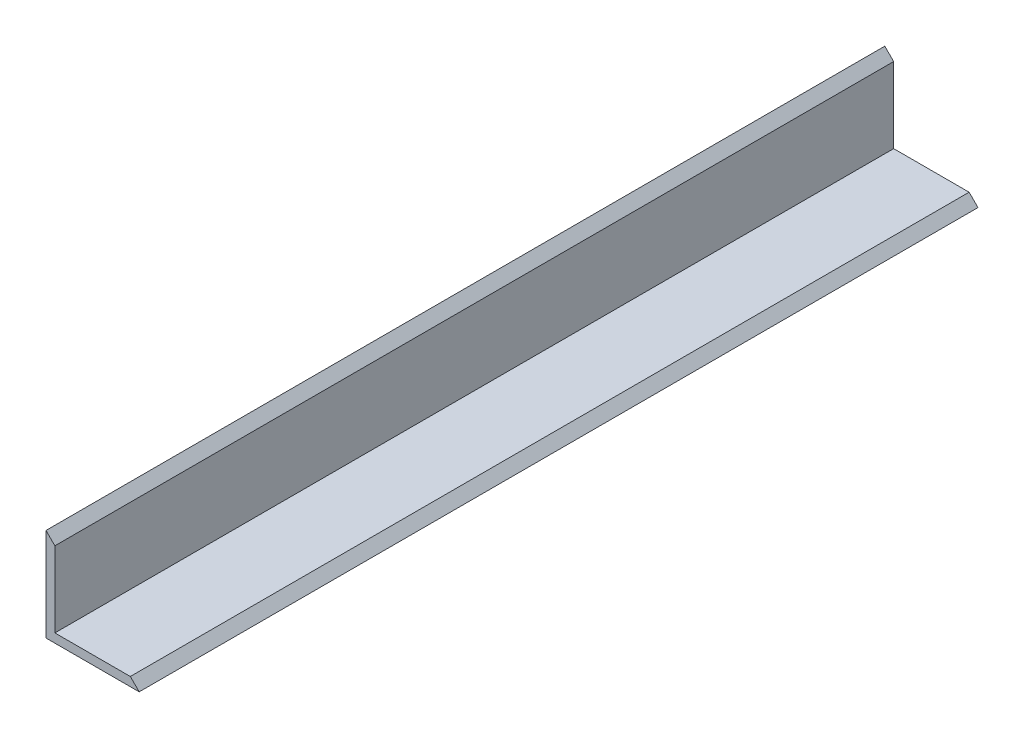
ISO-10303-21;
HEADER;
FILE_DESCRIPTION(('STEP AP214'),'2;1');
FILE_NAME('part.step','',(''),(''),'','','');
FILE_SCHEMA(('AUTOMOTIVE_DESIGN { 1 0 10303 214 1 1 1 1 }'));
ENDSEC;
DATA;
#1=APPLICATION_CONTEXT('core data for automotive mechanical design processes');
#2=APPLICATION_PROTOCOL_DEFINITION('international standard','automotive_design',2000,#1);
#3=PRODUCT_CONTEXT('',#1,'mechanical');
#4=PRODUCT('Part','Part','',(#3));
#5=PRODUCT_RELATED_PRODUCT_CATEGORY('part','',(#4));
#6=PRODUCT_DEFINITION_FORMATION('','',#4);
#7=PRODUCT_DEFINITION_CONTEXT('part definition',#1,'design');
#8=PRODUCT_DEFINITION('design','',#6,#7);
#9=PRODUCT_DEFINITION_SHAPE('','',#8);
#10=(LENGTH_UNIT() NAMED_UNIT(*) SI_UNIT(.MILLI.,.METRE.));
#11=(NAMED_UNIT(*) PLANE_ANGLE_UNIT() SI_UNIT($,.RADIAN.));
#12=(NAMED_UNIT(*) SI_UNIT($,.STERADIAN.) SOLID_ANGLE_UNIT());
#13=UNCERTAINTY_MEASURE_WITH_UNIT(LENGTH_MEASURE(1.E-05),#10,'distance_accuracy_value','');
#14=(GEOMETRIC_REPRESENTATION_CONTEXT(3) GLOBAL_UNCERTAINTY_ASSIGNED_CONTEXT((#13)) GLOBAL_UNIT_ASSIGNED_CONTEXT((#10,
#11,#12)) REPRESENTATION_CONTEXT('',''));
#15=CARTESIAN_POINT('',(0.,0.,0.));
#16=DIRECTION('',(0.,0.,1.));
#17=DIRECTION('',(1.,0.,0.));
#18=AXIS2_PLACEMENT_3D('',#15,#16,#17);
#19=CARTESIAN_POINT('',(-5.,100.,945.));
#20=DIRECTION('',(1.,0.,0.));
#21=DIRECTION('',(0.,0.,-1.));
#22=AXIS2_PLACEMENT_3D('',#19,#20,#21);
#23=PLANE('',#22);
#24=DIRECTION('',(0.,-1.,0.));
#25=VECTOR('',#24,1.);
#26=CARTESIAN_POINT('',(-5.,100.,0.));
#27=LINE('',#26,#25);
#28=CARTESIAN_POINT('',(-5.,100.,0.));
#29=VERTEX_POINT('',#28);
#30=CARTESIAN_POINT('',(-5.,-5.,0.));
#31=VERTEX_POINT('',#30);
#32=EDGE_CURVE('E117',#29,#31,#27,.T.);
#33=ORIENTED_EDGE('',*,*,#32,.T.);
#34=DIRECTION('',(0.,0.,-1.));
#35=VECTOR('',#34,1.);
#36=CARTESIAN_POINT('',(-5.,-5.,945.));
#37=LINE('',#36,#35);
#38=CARTESIAN_POINT('',(-5.,-5.,945.));
#39=VERTEX_POINT('',#38);
#40=EDGE_CURVE('E109',#39,#31,#37,.T.);
#41=ORIENTED_EDGE('',*,*,#40,.F.);
#42=DIRECTION('',(0.,-1.,0.));
#43=VECTOR('',#42,1.);
#44=CARTESIAN_POINT('',(-5.,100.,945.));
#45=LINE('',#44,#43);
#46=CARTESIAN_POINT('',(-5.,100.,945.));
#47=VERTEX_POINT('',#46);
#48=EDGE_CURVE('E102',#47,#39,#45,.T.);
#49=ORIENTED_EDGE('',*,*,#48,.F.);
#50=DIRECTION('',(0.,0.,-1.));
#51=VECTOR('',#50,1.);
#52=CARTESIAN_POINT('',(-5.,100.,945.));
#53=LINE('',#52,#51);
#54=EDGE_CURVE('E47',#47,#29,#53,.T.);
#55=ORIENTED_EDGE('',*,*,#54,.T.);
#56=EDGE_LOOP('',(#33,#41,#49,#55));
#57=FACE_BOUND('',#56,.T.);
#58=ADVANCED_FACE('F40',(#57),#23,.F.);
#59=CARTESIAN_POINT('',(-5.,-5.,945.));
#60=DIRECTION('',(0.,1.,0.));
#61=DIRECTION('',(0.,0.,1.));
#62=AXIS2_PLACEMENT_3D('',#59,#60,#61);
#63=PLANE('',#62);
#64=DIRECTION('',(1.,0.,0.));
#65=VECTOR('',#64,1.);
#66=CARTESIAN_POINT('',(-5.,-5.,0.));
#67=LINE('',#66,#65);
#68=CARTESIAN_POINT('',(100.,-5.,0.));
#69=VERTEX_POINT('',#68);
#70=EDGE_CURVE('E91',#31,#69,#67,.T.);
#71=ORIENTED_EDGE('',*,*,#70,.T.);
#72=DIRECTION('',(0.,0.,-1.));
#73=VECTOR('',#72,1.);
#74=CARTESIAN_POINT('',(100.,-5.,945.));
#75=LINE('',#74,#73);
#76=CARTESIAN_POINT('',(100.,-5.,945.));
#77=VERTEX_POINT('',#76);
#78=EDGE_CURVE('E97',#77,#69,#75,.T.);
#79=ORIENTED_EDGE('',*,*,#78,.F.);
#80=DIRECTION('',(1.,0.,0.));
#81=VECTOR('',#80,1.);
#82=CARTESIAN_POINT('',(-5.,-5.,945.));
#83=LINE('',#82,#81);
#84=EDGE_CURVE('E104',#39,#77,#83,.T.);
#85=ORIENTED_EDGE('',*,*,#84,.F.);
#86=ORIENTED_EDGE('',*,*,#40,.T.);
#87=EDGE_LOOP('',(#71,#79,#85,#86));
#88=FACE_BOUND('',#87,.T.);
#89=ADVANCED_FACE('F142',(#88),#63,.F.);
#90=CARTESIAN_POINT('',(5.,5.,945.));
#91=DIRECTION('',(0.,-1.,0.));
#92=DIRECTION('',(0.,0.,-1.));
#93=AXIS2_PLACEMENT_3D('',#90,#91,#92);
#94=PLANE('',#93);
#95=DIRECTION('',(-1.,0.,0.));
#96=VECTOR('',#95,1.);
#97=CARTESIAN_POINT('',(5.,5.,945.));
#98=LINE('',#97,#96);
#99=CARTESIAN_POINT('',(90.,4.99999999999998,945.));
#100=VERTEX_POINT('',#99);
#101=CARTESIAN_POINT('',(5.,5.,945.));
#102=VERTEX_POINT('',#101);
#103=EDGE_CURVE('E63',#100,#102,#98,.T.);
#104=ORIENTED_EDGE('',*,*,#103,.F.);
#105=DIRECTION('',(0.,0.,-1.));
#106=VECTOR('',#105,1.);
#107=CARTESIAN_POINT('',(90.,5.,945.));
#108=LINE('',#107,#106);
#109=CARTESIAN_POINT('',(90.,4.99999999999998,0.));
#110=VERTEX_POINT('',#109);
#111=EDGE_CURVE('E86',#100,#110,#108,.T.);
#112=ORIENTED_EDGE('',*,*,#111,.T.);
#113=DIRECTION('',(-1.,0.,0.));
#114=VECTOR('',#113,1.);
#115=CARTESIAN_POINT('',(5.,5.,0.));
#116=LINE('',#115,#114);
#117=CARTESIAN_POINT('',(5.,5.,0.));
#118=VERTEX_POINT('',#117);
#119=EDGE_CURVE('E80',#110,#118,#116,.T.);
#120=ORIENTED_EDGE('',*,*,#119,.T.);
#121=DIRECTION('',(0.,0.,-1.));
#122=VECTOR('',#121,1.);
#123=CARTESIAN_POINT('',(5.,5.,945.));
#124=LINE('',#123,#122);
#125=EDGE_CURVE('E83',#102,#118,#124,.T.);
#126=ORIENTED_EDGE('',*,*,#125,.F.);
#127=EDGE_LOOP('',(#104,#112,#120,#126));
#128=FACE_BOUND('',#127,.T.);
#129=ADVANCED_FACE('F82',(#128),#94,.F.);
#130=CARTESIAN_POINT('',(5.,100.,945.));
#131=DIRECTION('',(-1.,0.,0.));
#132=DIRECTION('',(0.,0.,1.));
#133=AXIS2_PLACEMENT_3D('',#130,#131,#132);
#134=PLANE('',#133);
#135=DIRECTION('',(0.,1.,0.));
#136=VECTOR('',#135,1.);
#137=CARTESIAN_POINT('',(5.,100.,0.));
#138=LINE('',#137,#136);
#139=CARTESIAN_POINT('',(4.99999999999999,90.,0.));
#140=VERTEX_POINT('',#139);
#141=EDGE_CURVE('E90',#118,#140,#138,.T.);
#142=ORIENTED_EDGE('',*,*,#141,.T.);
#143=DIRECTION('',(0.,0.,1.));
#144=VECTOR('',#143,1.);
#145=CARTESIAN_POINT('',(5.,90.,945.));
#146=LINE('',#145,#144);
#147=CARTESIAN_POINT('',(4.99999999999999,90.,945.));
#148=VERTEX_POINT('',#147);
#149=EDGE_CURVE('E54',#140,#148,#146,.T.);
#150=ORIENTED_EDGE('',*,*,#149,.T.);
#151=DIRECTION('',(0.,1.,0.));
#152=VECTOR('',#151,1.);
#153=CARTESIAN_POINT('',(5.,100.,945.));
#154=LINE('',#153,#152);
#155=EDGE_CURVE('E96',#102,#148,#154,.T.);
#156=ORIENTED_EDGE('',*,*,#155,.F.);
#157=ORIENTED_EDGE('',*,*,#125,.T.);
#158=EDGE_LOOP('',(#142,#150,#156,#157));
#159=FACE_BOUND('',#158,.T.);
#160=ADVANCED_FACE('F95',(#159),#134,.F.);
#161=CARTESIAN_POINT('',(0.,0.,945.));
#162=DIRECTION('',(0.,0.,-1.));
#163=DIRECTION('',(-1.,0.,0.));
#164=AXIS2_PLACEMENT_3D('',#161,#162,#163);
#165=PLANE('',#164);
#166=ORIENTED_EDGE('',*,*,#84,.T.);
#167=DIRECTION('',(0.707106781186548,-0.707106781186548,0.));
#168=VECTOR('',#167,1.);
#169=CARTESIAN_POINT('',(-5.,100.,945.));
#170=LINE('',#169,#168);
#171=EDGE_CURVE('E128',#100,#77,#170,.T.);
#172=ORIENTED_EDGE('',*,*,#171,.F.);
#173=ORIENTED_EDGE('',*,*,#103,.T.);
#174=ORIENTED_EDGE('',*,*,#155,.T.);
#175=EDGE_CURVE('E124',#47,#148,#170,.T.);
#176=ORIENTED_EDGE('',*,*,#175,.F.);
#177=ORIENTED_EDGE('',*,*,#48,.T.);
#178=EDGE_LOOP('',(#166,#172,#173,#174,#176,#177));
#179=FACE_BOUND('',#178,.T.);
#180=ADVANCED_FACE('F127',(#179),#165,.F.);
#181=CARTESIAN_POINT('',(0.,0.,0.));
#182=DIRECTION('',(0.,0.,-1.));
#183=DIRECTION('',(-1.,0.,0.));
#184=AXIS2_PLACEMENT_3D('',#181,#182,#183);
#185=PLANE('',#184);
#186=DIRECTION('',(-0.707106781186548,0.707106781186548,0.));
#187=VECTOR('',#186,1.);
#188=CARTESIAN_POINT('',(47.5,47.5,0.));
#189=LINE('',#188,#187);
#190=EDGE_CURVE('E11',#69,#110,#189,.T.);
#191=ORIENTED_EDGE('',*,*,#190,.F.);
#192=ORIENTED_EDGE('',*,*,#70,.F.);
#193=ORIENTED_EDGE('',*,*,#32,.F.);
#194=DIRECTION('',(0.707106781186548,-0.707106781186548,0.));
#195=VECTOR('',#194,1.);
#196=CARTESIAN_POINT('',(-5.,100.,0.));
#197=LINE('',#196,#195);
#198=EDGE_CURVE('E101',#29,#140,#197,.T.);
#199=ORIENTED_EDGE('',*,*,#198,.T.);
#200=ORIENTED_EDGE('',*,*,#141,.F.);
#201=ORIENTED_EDGE('',*,*,#119,.F.);
#202=EDGE_LOOP('',(#191,#192,#193,#199,#200,#201));
#203=FACE_BOUND('',#202,.T.);
#204=ADVANCED_FACE('F99',(#203),#185,.T.);
#205=CARTESIAN_POINT('',(-5.,100.,0.));
#206=DIRECTION('',(-0.707106781186547,-0.707106781186547,0.));
#207=DIRECTION('',(0.707106781186548,-0.707106781186548,0.));
#208=AXIS2_PLACEMENT_3D('',#205,#206,#207);
#209=PLANE('',#208);
#210=ORIENTED_EDGE('',*,*,#198,.F.);
#211=ORIENTED_EDGE('',*,*,#54,.F.);
#212=ORIENTED_EDGE('',*,*,#175,.T.);
#213=ORIENTED_EDGE('',*,*,#149,.F.);
#214=EDGE_LOOP('',(#210,#211,#212,#213));
#215=FACE_BOUND('',#214,.T.);
#216=ADVANCED_FACE('F123',(#215),#209,.F.);
#217=ORIENTED_EDGE('',*,*,#171,.T.);
#218=ORIENTED_EDGE('',*,*,#78,.T.);
#219=ORIENTED_EDGE('',*,*,#190,.T.);
#220=ORIENTED_EDGE('',*,*,#111,.F.);
#221=EDGE_LOOP('',(#217,#218,#219,#220));
#222=FACE_BOUND('',#221,.T.);
#223=ADVANCED_FACE('F145',(#222),#209,.F.);
#224=CLOSED_SHELL('',(#58,#89,#129,#160,#180,#204,#216,#223));
#225=MANIFOLD_SOLID_BREP('B2',#224);
#226=ADVANCED_BREP_SHAPE_REPRESENTATION('',(#18,#225),#14);
#227=SHAPE_DEFINITION_REPRESENTATION(#9,#226);
ENDSEC;
END-ISO-10303-21;
